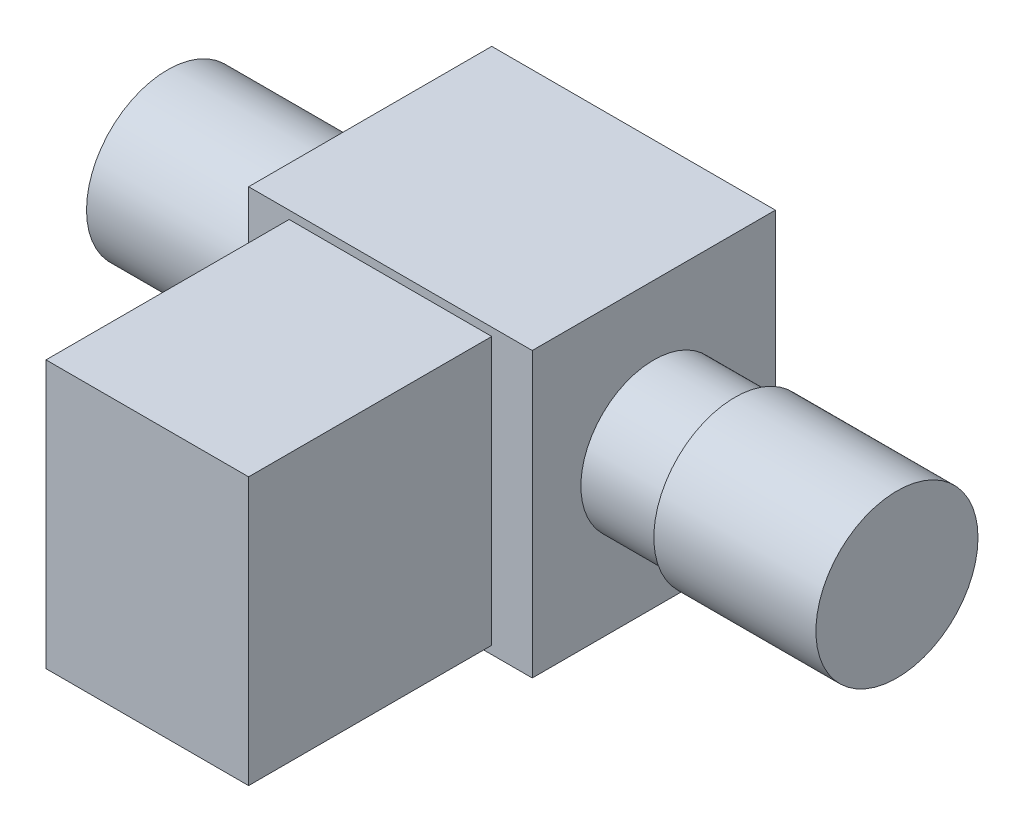
ISO-10303-21;
HEADER;
FILE_DESCRIPTION(('STEP AP214'),'2;1');
FILE_NAME('part.step','',(''),(''),'','','');
FILE_SCHEMA(('AUTOMOTIVE_DESIGN { 1 0 10303 214 1 1 1 1 }'));
ENDSEC;
DATA;
#1=APPLICATION_CONTEXT('core data for automotive mechanical design processes');
#2=APPLICATION_PROTOCOL_DEFINITION('international standard','automotive_design',2000,#1);
#3=PRODUCT_CONTEXT('',#1,'mechanical');
#4=PRODUCT('Part','Part','',(#3));
#5=PRODUCT_RELATED_PRODUCT_CATEGORY('part','',(#4));
#6=PRODUCT_DEFINITION_FORMATION('','',#4);
#7=PRODUCT_DEFINITION_CONTEXT('part definition',#1,'design');
#8=PRODUCT_DEFINITION('design','',#6,#7);
#9=PRODUCT_DEFINITION_SHAPE('','',#8);
#10=(LENGTH_UNIT() NAMED_UNIT(*) SI_UNIT(.MILLI.,.METRE.));
#11=(NAMED_UNIT(*) PLANE_ANGLE_UNIT() SI_UNIT($,.RADIAN.));
#12=(NAMED_UNIT(*) SI_UNIT($,.STERADIAN.) SOLID_ANGLE_UNIT());
#13=UNCERTAINTY_MEASURE_WITH_UNIT(LENGTH_MEASURE(1.E-05),#10,'distance_accuracy_value','');
#14=(GEOMETRIC_REPRESENTATION_CONTEXT(3) GLOBAL_UNCERTAINTY_ASSIGNED_CONTEXT((#13)) GLOBAL_UNIT_ASSIGNED_CONTEXT((#10,
#11,#12)) REPRESENTATION_CONTEXT('',''));
#15=CARTESIAN_POINT('',(0.,0.,0.));
#16=DIRECTION('',(0.,0.,1.));
#17=DIRECTION('',(1.,0.,0.));
#18=AXIS2_PLACEMENT_3D('',#15,#16,#17);
#19=CARTESIAN_POINT('',(-17.5,17.5,30.));
#20=DIRECTION('',(0.,-1.,0.));
#21=DIRECTION('',(0.,0.,-1.));
#22=AXIS2_PLACEMENT_3D('',#19,#20,#21);
#23=PLANE('',#22);
#24=DIRECTION('',(0.,0.,-1.));
#25=VECTOR('',#24,1.);
#26=CARTESIAN_POINT('',(-17.5,17.5,30.));
#27=LINE('',#26,#25);
#28=CARTESIAN_POINT('',(-17.5,17.5,30.));
#29=VERTEX_POINT('',#28);
#30=CARTESIAN_POINT('',(-17.5,17.5,0.));
#31=VERTEX_POINT('',#30);
#32=EDGE_CURVE('E175',#29,#31,#27,.T.);
#33=ORIENTED_EDGE('',*,*,#32,.F.);
#34=DIRECTION('',(-1.,0.,0.));
#35=VECTOR('',#34,1.);
#36=CARTESIAN_POINT('',(-17.5,17.5,30.));
#37=LINE('',#36,#35);
#38=CARTESIAN_POINT('',(17.5,17.5,30.));
#39=VERTEX_POINT('',#38);
#40=EDGE_CURVE('E146',#39,#29,#37,.T.);
#41=ORIENTED_EDGE('',*,*,#40,.F.);
#42=DIRECTION('',(0.,0.,-1.));
#43=VECTOR('',#42,1.);
#44=CARTESIAN_POINT('',(17.5,17.5,30.));
#45=LINE('',#44,#43);
#46=CARTESIAN_POINT('',(17.5,17.5,0.));
#47=VERTEX_POINT('',#46);
#48=EDGE_CURVE('E45',#39,#47,#45,.T.);
#49=ORIENTED_EDGE('',*,*,#48,.T.);
#50=DIRECTION('',(-1.,0.,0.));
#51=VECTOR('',#50,1.);
#52=CARTESIAN_POINT('',(-17.5,17.5,0.));
#53=LINE('',#52,#51);
#54=EDGE_CURVE('E161',#47,#31,#53,.T.);
#55=ORIENTED_EDGE('',*,*,#54,.T.);
#56=EDGE_LOOP('',(#33,#41,#49,#55));
#57=FACE_BOUND('',#56,.T.);
#58=ADVANCED_FACE('F41',(#57),#23,.F.);
#59=CARTESIAN_POINT('',(-17.5,-17.5,30.));
#60=DIRECTION('',(0.,1.,0.));
#61=DIRECTION('',(0.,0.,1.));
#62=AXIS2_PLACEMENT_3D('',#59,#60,#61);
#63=PLANE('',#62);
#64=DIRECTION('',(0.,0.,-1.));
#65=VECTOR('',#64,1.);
#66=CARTESIAN_POINT('',(17.5,-17.5,30.));
#67=LINE('',#66,#65);
#68=CARTESIAN_POINT('',(17.5,-17.5,30.));
#69=VERTEX_POINT('',#68);
#70=CARTESIAN_POINT('',(17.5,-17.5,0.));
#71=VERTEX_POINT('',#70);
#72=EDGE_CURVE('E156',#69,#71,#67,.T.);
#73=ORIENTED_EDGE('',*,*,#72,.F.);
#74=DIRECTION('',(1.,0.,0.));
#75=VECTOR('',#74,1.);
#76=CARTESIAN_POINT('',(-17.5,-17.5,30.));
#77=LINE('',#76,#75);
#78=CARTESIAN_POINT('',(-17.5,-17.5,30.));
#79=VERTEX_POINT('',#78);
#80=EDGE_CURVE('E153',#79,#69,#77,.T.);
#81=ORIENTED_EDGE('',*,*,#80,.F.);
#82=DIRECTION('',(0.,0.,-1.));
#83=VECTOR('',#82,1.);
#84=CARTESIAN_POINT('',(-17.5,-17.5,30.));
#85=LINE('',#84,#83);
#86=CARTESIAN_POINT('',(-17.5,-17.5,0.));
#87=VERTEX_POINT('',#86);
#88=EDGE_CURVE('E172',#79,#87,#85,.T.);
#89=ORIENTED_EDGE('',*,*,#88,.T.);
#90=DIRECTION('',(1.,0.,0.));
#91=VECTOR('',#90,1.);
#92=CARTESIAN_POINT('',(-17.5,-17.5,0.));
#93=LINE('',#92,#91);
#94=EDGE_CURVE('E147',#87,#71,#93,.T.);
#95=ORIENTED_EDGE('',*,*,#94,.T.);
#96=EDGE_LOOP('',(#73,#81,#89,#95));
#97=FACE_BOUND('',#96,.T.);
#98=ADVANCED_FACE('F198',(#97),#63,.F.);
#99=CARTESIAN_POINT('',(12.5,-17.5,60.));
#100=DIRECTION('',(-1.,0.,0.));
#101=DIRECTION('',(0.,0.,1.));
#102=AXIS2_PLACEMENT_3D('',#99,#100,#101);
#103=PLANE('',#102);
#104=DIRECTION('',(0.,1.,0.));
#105=VECTOR('',#104,1.);
#106=CARTESIAN_POINT('',(12.5,-17.5,30.));
#107=LINE('',#106,#105);
#108=CARTESIAN_POINT('',(12.5,-16.5,30.));
#109=VERTEX_POINT('',#108);
#110=CARTESIAN_POINT('',(12.5,16.5,30.));
#111=VERTEX_POINT('',#110);
#112=EDGE_CURVE('E132',#109,#111,#107,.T.);
#113=ORIENTED_EDGE('',*,*,#112,.T.);
#114=DIRECTION('',(0.,0.,1.));
#115=VECTOR('',#114,1.);
#116=CARTESIAN_POINT('',(12.5,16.5,30.));
#117=LINE('',#116,#115);
#118=CARTESIAN_POINT('',(12.5,16.5,60.));
#119=VERTEX_POINT('',#118);
#120=EDGE_CURVE('E109',#111,#119,#117,.T.);
#121=ORIENTED_EDGE('',*,*,#120,.T.);
#122=DIRECTION('',(0.,1.,0.));
#123=VECTOR('',#122,1.);
#124=CARTESIAN_POINT('',(12.5,-17.5,60.));
#125=LINE('',#124,#123);
#126=CARTESIAN_POINT('',(12.5,-16.5,60.));
#127=VERTEX_POINT('',#126);
#128=EDGE_CURVE('E131',#127,#119,#125,.T.);
#129=ORIENTED_EDGE('',*,*,#128,.F.);
#130=DIRECTION('',(0.,0.,1.));
#131=VECTOR('',#130,1.);
#132=CARTESIAN_POINT('',(12.5,-16.5,30.));
#133=LINE('',#132,#131);
#134=EDGE_CURVE('E66',#109,#127,#133,.T.);
#135=ORIENTED_EDGE('',*,*,#134,.F.);
#136=EDGE_LOOP('',(#113,#121,#129,#135));
#137=FACE_BOUND('',#136,.T.);
#138=ADVANCED_FACE('F215',(#137),#103,.F.);
#139=CARTESIAN_POINT('',(-12.5,-17.5,60.));
#140=DIRECTION('',(1.,0.,0.));
#141=DIRECTION('',(0.,0.,-1.));
#142=AXIS2_PLACEMENT_3D('',#139,#140,#141);
#143=PLANE('',#142);
#144=DIRECTION('',(0.,-1.,0.));
#145=VECTOR('',#144,1.);
#146=CARTESIAN_POINT('',(-12.5,-17.5,60.));
#147=LINE('',#146,#145);
#148=CARTESIAN_POINT('',(-12.5,16.5,60.));
#149=VERTEX_POINT('',#148);
#150=CARTESIAN_POINT('',(-12.5,-16.5,60.));
#151=VERTEX_POINT('',#150);
#152=EDGE_CURVE('E124',#149,#151,#147,.T.);
#153=ORIENTED_EDGE('',*,*,#152,.F.);
#154=DIRECTION('',(0.,0.,1.));
#155=VECTOR('',#154,1.);
#156=CARTESIAN_POINT('',(-12.5,16.5,30.));
#157=LINE('',#156,#155);
#158=CARTESIAN_POINT('',(-12.5,16.5,30.));
#159=VERTEX_POINT('',#158);
#160=EDGE_CURVE('E58',#159,#149,#157,.T.);
#161=ORIENTED_EDGE('',*,*,#160,.F.);
#162=DIRECTION('',(0.,-1.,0.));
#163=VECTOR('',#162,1.);
#164=CARTESIAN_POINT('',(-12.5,-17.5,30.));
#165=LINE('',#164,#163);
#166=CARTESIAN_POINT('',(-12.5,-16.5,30.));
#167=VERTEX_POINT('',#166);
#168=EDGE_CURVE('E122',#159,#167,#165,.T.);
#169=ORIENTED_EDGE('',*,*,#168,.T.);
#170=DIRECTION('',(0.,0.,1.));
#171=VECTOR('',#170,1.);
#172=CARTESIAN_POINT('',(-12.5,-16.5,30.));
#173=LINE('',#172,#171);
#174=EDGE_CURVE('E245',#167,#151,#173,.T.);
#175=ORIENTED_EDGE('',*,*,#174,.T.);
#176=EDGE_LOOP('',(#153,#161,#169,#175));
#177=FACE_BOUND('',#176,.T.);
#178=ADVANCED_FACE('F120',(#177),#143,.F.);
#179=CARTESIAN_POINT('',(0.,0.,60.));
#180=DIRECTION('',(0.,0.,-1.));
#181=DIRECTION('',(-1.,0.,0.));
#182=AXIS2_PLACEMENT_3D('',#179,#180,#181);
#183=PLANE('',#182);
#184=ORIENTED_EDGE('',*,*,#128,.T.);
#185=DIRECTION('',(1.,0.,0.));
#186=VECTOR('',#185,1.);
#187=CARTESIAN_POINT('',(0.,16.5,60.));
#188=LINE('',#187,#186);
#189=EDGE_CURVE('E115',#149,#119,#188,.T.);
#190=ORIENTED_EDGE('',*,*,#189,.F.);
#191=ORIENTED_EDGE('',*,*,#152,.T.);
#192=DIRECTION('',(1.,0.,0.));
#193=VECTOR('',#192,1.);
#194=CARTESIAN_POINT('',(0.,-16.5,60.));
#195=LINE('',#194,#193);
#196=EDGE_CURVE('E252',#151,#127,#195,.T.);
#197=ORIENTED_EDGE('',*,*,#196,.T.);
#198=EDGE_LOOP('',(#184,#190,#191,#197));
#199=FACE_BOUND('',#198,.T.);
#200=ADVANCED_FACE('F201',(#199),#183,.F.);
#201=CARTESIAN_POINT('',(0.,0.,30.));
#202=DIRECTION('',(0.,0.,-1.));
#203=DIRECTION('',(-1.,0.,0.));
#204=AXIS2_PLACEMENT_3D('',#201,#202,#203);
#205=PLANE('',#204);
#206=ORIENTED_EDGE('',*,*,#40,.T.);
#207=DIRECTION('',(0.,-1.,0.));
#208=VECTOR('',#207,1.);
#209=CARTESIAN_POINT('',(-17.5,-17.5,30.));
#210=LINE('',#209,#208);
#211=EDGE_CURVE('E150',#29,#79,#210,.T.);
#212=ORIENTED_EDGE('',*,*,#211,.T.);
#213=ORIENTED_EDGE('',*,*,#80,.T.);
#214=DIRECTION('',(0.,1.,0.));
#215=VECTOR('',#214,1.);
#216=CARTESIAN_POINT('',(17.5,-17.5,30.));
#217=LINE('',#216,#215);
#218=EDGE_CURVE('E142',#69,#39,#217,.T.);
#219=ORIENTED_EDGE('',*,*,#218,.T.);
#220=EDGE_LOOP('',(#206,#212,#213,#219));
#221=FACE_BOUND('',#220,.T.);
#222=ORIENTED_EDGE('',*,*,#168,.F.);
#223=DIRECTION('',(1.,0.,0.));
#224=VECTOR('',#223,1.);
#225=CARTESIAN_POINT('',(0.,16.5,30.));
#226=LINE('',#225,#224);
#227=EDGE_CURVE('E106',#159,#111,#226,.T.);
#228=ORIENTED_EDGE('',*,*,#227,.T.);
#229=ORIENTED_EDGE('',*,*,#112,.F.);
#230=DIRECTION('',(1.,0.,0.));
#231=VECTOR('',#230,1.);
#232=CARTESIAN_POINT('',(0.,-16.5,30.));
#233=LINE('',#232,#231);
#234=EDGE_CURVE('E129',#167,#109,#233,.T.);
#235=ORIENTED_EDGE('',*,*,#234,.F.);
#236=EDGE_LOOP('',(#222,#228,#229,#235));
#237=FACE_BOUND('',#236,.T.);
#238=ADVANCED_FACE('F128',(#221,#237),#205,.F.);
#239=CARTESIAN_POINT('',(17.5,-17.5,30.));
#240=DIRECTION('',(-1.,0.,0.));
#241=DIRECTION('',(0.,0.,1.));
#242=AXIS2_PLACEMENT_3D('',#239,#240,#241);
#243=PLANE('',#242);
#244=DIRECTION('',(0.,1.,0.));
#245=VECTOR('',#244,1.);
#246=CARTESIAN_POINT('',(17.5,-17.5,0.));
#247=LINE('',#246,#245);
#248=EDGE_CURVE('E157',#71,#47,#247,.T.);
#249=ORIENTED_EDGE('',*,*,#248,.T.);
#250=ORIENTED_EDGE('',*,*,#48,.F.);
#251=ORIENTED_EDGE('',*,*,#218,.F.);
#252=ORIENTED_EDGE('',*,*,#72,.T.);
#253=EDGE_LOOP('',(#249,#250,#251,#252));
#254=FACE_BOUND('',#253,.T.);
#255=CARTESIAN_POINT('',(17.5,0.,15.));
#256=DIRECTION('',(1.,0.,0.));
#257=DIRECTION('',(0.,0.,-1.));
#258=AXIS2_PLACEMENT_3D('',#255,#256,#257);
#259=CIRCLE('',#258,9.);
#260=CARTESIAN_POINT('',(17.5,0.,6.));
#261=VERTEX_POINT('',#260);
#262=EDGE_CURVE('E260',#261,#261,#259,.T.);
#263=ORIENTED_EDGE('',*,*,#262,.F.);
#264=EDGE_LOOP('',(#263));
#265=FACE_BOUND('',#264,.T.);
#266=ADVANCED_FACE('F43',(#254,#265),#243,.F.);
#267=CARTESIAN_POINT('',(-17.5,-17.5,30.));
#268=DIRECTION('',(1.,0.,0.));
#269=DIRECTION('',(0.,0.,-1.));
#270=AXIS2_PLACEMENT_3D('',#267,#268,#269);
#271=PLANE('',#270);
#272=CARTESIAN_POINT('',(-17.5,0.,15.));
#273=DIRECTION('',(-1.,0.,0.));
#274=DIRECTION('',(0.,0.,1.));
#275=AXIS2_PLACEMENT_3D('',#272,#273,#274);
#276=CIRCLE('',#275,10.);
#277=CARTESIAN_POINT('',(-17.5,0.,25.));
#278=VERTEX_POINT('',#277);
#279=EDGE_CURVE('E11',#278,#278,#276,.T.);
#280=ORIENTED_EDGE('',*,*,#279,.F.);
#281=EDGE_LOOP('',(#280));
#282=FACE_BOUND('',#281,.T.);
#283=DIRECTION('',(0.,-1.,0.));
#284=VECTOR('',#283,1.);
#285=CARTESIAN_POINT('',(-17.5,-17.5,0.));
#286=LINE('',#285,#284);
#287=EDGE_CURVE('E164',#31,#87,#286,.T.);
#288=ORIENTED_EDGE('',*,*,#287,.T.);
#289=ORIENTED_EDGE('',*,*,#88,.F.);
#290=ORIENTED_EDGE('',*,*,#211,.F.);
#291=ORIENTED_EDGE('',*,*,#32,.T.);
#292=EDGE_LOOP('',(#288,#289,#290,#291));
#293=FACE_BOUND('',#292,.T.);
#294=ADVANCED_FACE('F195',(#282,#293),#271,.F.);
#295=CARTESIAN_POINT('',(0.,0.,0.));
#296=DIRECTION('',(0.,0.,-1.));
#297=DIRECTION('',(-1.,0.,0.));
#298=AXIS2_PLACEMENT_3D('',#295,#296,#297);
#299=PLANE('',#298);
#300=ORIENTED_EDGE('',*,*,#248,.F.);
#301=ORIENTED_EDGE('',*,*,#94,.F.);
#302=ORIENTED_EDGE('',*,*,#287,.F.);
#303=ORIENTED_EDGE('',*,*,#54,.F.);
#304=EDGE_LOOP('',(#300,#301,#302,#303));
#305=FACE_BOUND('',#304,.T.);
#306=ADVANCED_FACE('F193',(#305),#299,.T.);
#307=CARTESIAN_POINT('',(-42.5,0.,15.));
#308=DIRECTION('',(1.,0.,0.));
#309=DIRECTION('',(0.,0.,-1.));
#310=AXIS2_PLACEMENT_3D('',#307,#308,#309);
#311=CYLINDRICAL_SURFACE('',#310,10.);
#312=CARTESIAN_POINT('',(-42.5,0.,15.));
#313=DIRECTION('',(-1.,0.,0.));
#314=DIRECTION('',(0.,0.,1.));
#315=AXIS2_PLACEMENT_3D('',#312,#313,#314);
#316=CIRCLE('',#315,10.);
#317=CARTESIAN_POINT('',(-42.5,0.,25.));
#318=VERTEX_POINT('',#317);
#319=EDGE_CURVE('E138',#318,#318,#316,.T.);
#320=ORIENTED_EDGE('',*,*,#319,.F.);
#321=EDGE_LOOP('',(#320));
#322=FACE_BOUND('',#321,.T.);
#323=ORIENTED_EDGE('',*,*,#279,.T.);
#324=EDGE_LOOP('',(#323));
#325=FACE_BOUND('',#324,.T.);
#326=ADVANCED_FACE('F221',(#322,#325),#311,.T.);
#327=CARTESIAN_POINT('',(-42.5,0.,15.));
#328=DIRECTION('',(-1.,0.,0.));
#329=DIRECTION('',(0.,0.,1.));
#330=AXIS2_PLACEMENT_3D('',#327,#328,#329);
#331=PLANE('',#330);
#332=ORIENTED_EDGE('',*,*,#319,.T.);
#333=EDGE_LOOP('',(#332));
#334=FACE_BOUND('',#333,.T.);
#335=ADVANCED_FACE('F225',(#334),#331,.T.);
#336=CARTESIAN_POINT('',(27.5,0.,15.));
#337=DIRECTION('',(-1.,0.,0.));
#338=DIRECTION('',(0.,0.,1.));
#339=AXIS2_PLACEMENT_3D('',#336,#337,#338);
#340=CYLINDRICAL_SURFACE('',#339,9.);
#341=CARTESIAN_POINT('',(27.5,0.,15.));
#342=DIRECTION('',(1.,0.,0.));
#343=DIRECTION('',(0.,0.,-1.));
#344=AXIS2_PLACEMENT_3D('',#341,#342,#343);
#345=CIRCLE('',#344,9.);
#346=CARTESIAN_POINT('',(27.5,0.,6.));
#347=VERTEX_POINT('',#346);
#348=EDGE_CURVE('E255',#347,#347,#345,.T.);
#349=ORIENTED_EDGE('',*,*,#348,.F.);
#350=EDGE_LOOP('',(#349));
#351=FACE_BOUND('',#350,.T.);
#352=ORIENTED_EDGE('',*,*,#262,.T.);
#353=EDGE_LOOP('',(#352));
#354=FACE_BOUND('',#353,.T.);
#355=ADVANCED_FACE('F231',(#351,#354),#340,.T.);
#356=CARTESIAN_POINT('',(27.5,0.,0.));
#357=DIRECTION('',(1.,0.,0.));
#358=DIRECTION('',(0.,0.,-1.));
#359=AXIS2_PLACEMENT_3D('',#356,#357,#358);
#360=PLANE('',#359);
#361=ORIENTED_EDGE('',*,*,#348,.T.);
#362=EDGE_LOOP('',(#361));
#363=FACE_BOUND('',#362,.T.);
#364=CARTESIAN_POINT('',(27.5,0.,15.));
#365=DIRECTION('',(1.,0.,0.));
#366=DIRECTION('',(0.,0.,-1.));
#367=AXIS2_PLACEMENT_3D('',#364,#365,#366);
#368=CIRCLE('',#367,10.);
#369=CARTESIAN_POINT('',(27.5,0.,4.99999999999999));
#370=VERTEX_POINT('',#369);
#371=EDGE_CURVE('E259',#370,#370,#368,.F.);
#372=ORIENTED_EDGE('',*,*,#371,.T.);
#373=EDGE_LOOP('',(#372));
#374=FACE_BOUND('',#373,.T.);
#375=ADVANCED_FACE('F290',(#363,#374),#360,.F.);
#376=CARTESIAN_POINT('',(47.5,0.,15.));
#377=DIRECTION('',(1.,0.,0.));
#378=DIRECTION('',(0.,0.,-1.));
#379=AXIS2_PLACEMENT_3D('',#376,#377,#378);
#380=PLANE('',#379);
#381=CARTESIAN_POINT('',(47.5,0.,15.));
#382=DIRECTION('',(1.,0.,0.));
#383=DIRECTION('',(0.,0.,-1.));
#384=AXIS2_PLACEMENT_3D('',#381,#382,#383);
#385=CIRCLE('',#384,10.);
#386=CARTESIAN_POINT('',(47.5,0.,4.99999999999999));
#387=VERTEX_POINT('',#386);
#388=EDGE_CURVE('E264',#387,#387,#385,.T.);
#389=ORIENTED_EDGE('',*,*,#388,.T.);
#390=EDGE_LOOP('',(#389));
#391=FACE_BOUND('',#390,.T.);
#392=ADVANCED_FACE('F287',(#391),#380,.T.);
#393=CARTESIAN_POINT('',(47.5,0.,15.));
#394=DIRECTION('',(-1.,0.,0.));
#395=DIRECTION('',(0.,0.,1.));
#396=AXIS2_PLACEMENT_3D('',#393,#394,#395);
#397=CYLINDRICAL_SURFACE('',#396,10.);
#398=ORIENTED_EDGE('',*,*,#371,.F.);
#399=EDGE_LOOP('',(#398));
#400=FACE_BOUND('',#399,.T.);
#401=ORIENTED_EDGE('',*,*,#388,.F.);
#402=EDGE_LOOP('',(#401));
#403=FACE_BOUND('',#402,.T.);
#404=ADVANCED_FACE('F280',(#400,#403),#397,.T.);
#405=CARTESIAN_POINT('',(0.,-16.5,30.));
#406=DIRECTION('',(0.,-1.,0.));
#407=DIRECTION('',(0.,0.,-1.));
#408=AXIS2_PLACEMENT_3D('',#405,#406,#407);
#409=PLANE('',#408);
#410=ORIENTED_EDGE('',*,*,#196,.F.);
#411=ORIENTED_EDGE('',*,*,#174,.F.);
#412=ORIENTED_EDGE('',*,*,#234,.T.);
#413=ORIENTED_EDGE('',*,*,#134,.T.);
#414=EDGE_LOOP('',(#410,#411,#412,#413));
#415=FACE_BOUND('',#414,.T.);
#416=ADVANCED_FACE('F278',(#415),#409,.T.);
#417=CARTESIAN_POINT('',(0.,16.5,30.));
#418=DIRECTION('',(0.,-1.,0.));
#419=DIRECTION('',(0.,0.,-1.));
#420=AXIS2_PLACEMENT_3D('',#417,#418,#419);
#421=PLANE('',#420);
#422=ORIENTED_EDGE('',*,*,#189,.T.);
#423=ORIENTED_EDGE('',*,*,#120,.F.);
#424=ORIENTED_EDGE('',*,*,#227,.F.);
#425=ORIENTED_EDGE('',*,*,#160,.T.);
#426=EDGE_LOOP('',(#422,#423,#424,#425));
#427=FACE_BOUND('',#426,.T.);
#428=ADVANCED_FACE('F107',(#427),#421,.F.);
#429=CLOSED_SHELL('',(#58,#98,#138,#178,#200,#238,#266,#294,#306,#326,#335,#355,#375,#392,#404,
#416,#428));
#430=MANIFOLD_SOLID_BREP('B2',#429);
#431=ADVANCED_BREP_SHAPE_REPRESENTATION('',(#18,#430),#14);
#432=SHAPE_DEFINITION_REPRESENTATION(#9,#431);
ENDSEC;
END-ISO-10303-21;
